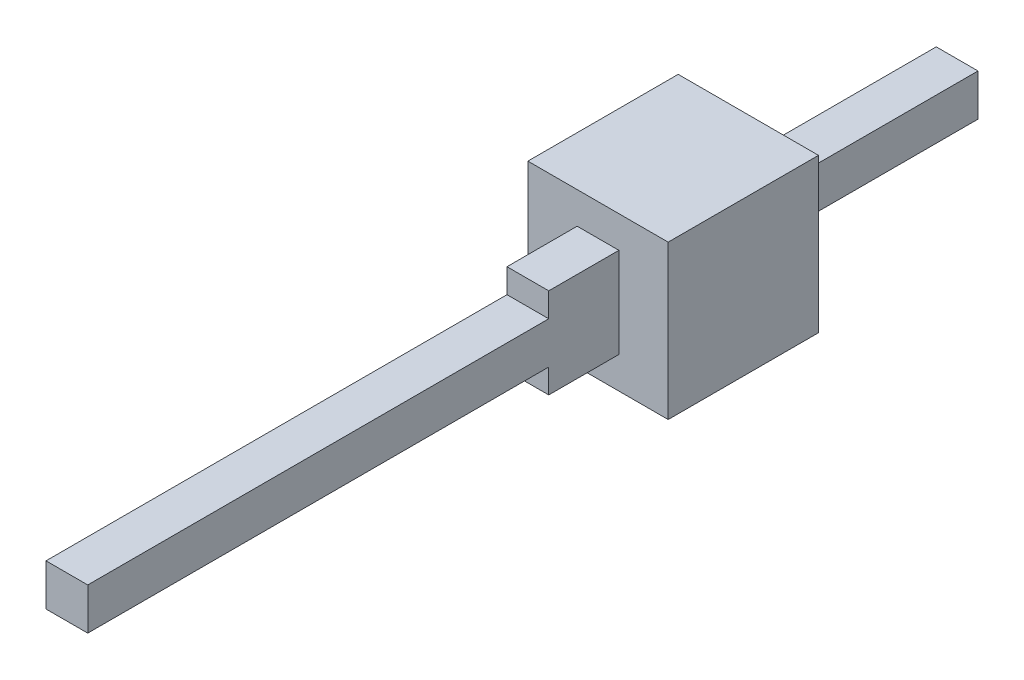
ISO-10303-21;
HEADER;
FILE_DESCRIPTION(('STEP AP214'),'2;1');
FILE_NAME('part.step','',(''),(''),'','','');
FILE_SCHEMA(('AUTOMOTIVE_DESIGN { 1 0 10303 214 1 1 1 1 }'));
ENDSEC;
DATA;
#1=APPLICATION_CONTEXT('core data for automotive mechanical design processes');
#2=APPLICATION_PROTOCOL_DEFINITION('international standard','automotive_design',2000,#1);
#3=PRODUCT_CONTEXT('',#1,'mechanical');
#4=PRODUCT('Part','Part','',(#3));
#5=PRODUCT_RELATED_PRODUCT_CATEGORY('part','',(#4));
#6=PRODUCT_DEFINITION_FORMATION('','',#4);
#7=PRODUCT_DEFINITION_CONTEXT('part definition',#1,'design');
#8=PRODUCT_DEFINITION('design','',#6,#7);
#9=PRODUCT_DEFINITION_SHAPE('','',#8);
#10=(LENGTH_UNIT() NAMED_UNIT(*) SI_UNIT(.MILLI.,.METRE.));
#11=(NAMED_UNIT(*) PLANE_ANGLE_UNIT() SI_UNIT($,.RADIAN.));
#12=(NAMED_UNIT(*) SI_UNIT($,.STERADIAN.) SOLID_ANGLE_UNIT());
#13=UNCERTAINTY_MEASURE_WITH_UNIT(LENGTH_MEASURE(1.E-05),#10,'distance_accuracy_value','');
#14=(GEOMETRIC_REPRESENTATION_CONTEXT(3) GLOBAL_UNCERTAINTY_ASSIGNED_CONTEXT((#13)) GLOBAL_UNIT_ASSIGNED_CONTEXT((#10,
#11,#12)) REPRESENTATION_CONTEXT('',''));
#15=CARTESIAN_POINT('',(0.,0.,0.));
#16=DIRECTION('',(0.,0.,1.));
#17=DIRECTION('',(1.,0.,0.));
#18=AXIS2_PLACEMENT_3D('',#15,#16,#17);
#19=CARTESIAN_POINT('',(0.3175,-0.3175,-5.461));
#20=DIRECTION('',(0.,-1.,0.));
#21=DIRECTION('',(0.,0.,-1.));
#22=AXIS2_PLACEMENT_3D('',#19,#20,#21);
#23=PLANE('',#22);
#24=DIRECTION('',(0.,0.,1.));
#25=VECTOR('',#24,1.);
#26=CARTESIAN_POINT('',(0.3175,-0.3175,0.));
#27=LINE('',#26,#25);
#28=CARTESIAN_POINT('',(0.3175,-0.3175,-5.461));
#29=VERTEX_POINT('',#28);
#30=CARTESIAN_POINT('',(0.3175,-0.3175,-2.286));
#31=VERTEX_POINT('',#30);
#32=EDGE_CURVE('E157',#29,#31,#27,.T.);
#33=ORIENTED_EDGE('',*,*,#32,.T.);
#34=DIRECTION('',(1.,0.,0.));
#35=VECTOR('',#34,1.);
#36=CARTESIAN_POINT('',(0.3175,-0.3175,-2.286));
#37=LINE('',#36,#35);
#38=CARTESIAN_POINT('',(-0.3175,-0.3175,-2.286));
#39=VERTEX_POINT('',#38);
#40=EDGE_CURVE('E20',#31,#39,#37,.F.);
#41=ORIENTED_EDGE('',*,*,#40,.T.);
#42=DIRECTION('',(0.,0.,1.));
#43=VECTOR('',#42,1.);
#44=CARTESIAN_POINT('',(-0.3175,-0.3175,0.));
#45=LINE('',#44,#43);
#46=CARTESIAN_POINT('',(-0.3175,-0.3175,-5.461));
#47=VERTEX_POINT('',#46);
#48=EDGE_CURVE('E193',#47,#39,#45,.T.);
#49=ORIENTED_EDGE('',*,*,#48,.F.);
#50=DIRECTION('',(-1.,0.,0.));
#51=VECTOR('',#50,1.);
#52=CARTESIAN_POINT('',(0.3175,-0.3175,-5.461));
#53=LINE('',#52,#51);
#54=EDGE_CURVE('E178',#29,#47,#53,.T.);
#55=ORIENTED_EDGE('',*,*,#54,.F.);
#56=EDGE_LOOP('',(#33,#41,#49,#55));
#57=FACE_BOUND('',#56,.T.);
#58=ADVANCED_FACE('F17',(#57),#23,.T.);
#59=CARTESIAN_POINT('',(0.3175,0.,0.));
#60=DIRECTION('',(-1.,0.,0.));
#61=DIRECTION('',(0.,0.,1.));
#62=AXIS2_PLACEMENT_3D('',#59,#60,#61);
#63=PLANE('',#62);
#64=DIRECTION('',(0.,1.,0.));
#65=VECTOR('',#64,1.);
#66=CARTESIAN_POINT('',(0.3175,0.3175,-5.461));
#67=LINE('',#66,#65);
#68=CARTESIAN_POINT('',(0.3175,0.3175,-5.461));
#69=VERTEX_POINT('',#68);
#70=EDGE_CURVE('E184',#69,#29,#67,.F.);
#71=ORIENTED_EDGE('',*,*,#70,.F.);
#72=DIRECTION('',(0.,0.,1.));
#73=VECTOR('',#72,1.);
#74=CARTESIAN_POINT('',(0.3175,0.3175,-2.286));
#75=LINE('',#74,#73);
#76=CARTESIAN_POINT('',(0.3175,0.3175,-2.286));
#77=VERTEX_POINT('',#76);
#78=EDGE_CURVE('E164',#77,#69,#75,.F.);
#79=ORIENTED_EDGE('',*,*,#78,.F.);
#80=DIRECTION('',(0.,1.,0.));
#81=VECTOR('',#80,1.);
#82=CARTESIAN_POINT('',(0.3175,0.,-2.286));
#83=LINE('',#82,#81);
#84=EDGE_CURVE('E161',#31,#77,#83,.T.);
#85=ORIENTED_EDGE('',*,*,#84,.F.);
#86=ORIENTED_EDGE('',*,*,#32,.F.);
#87=EDGE_LOOP('',(#71,#79,#85,#86));
#88=FACE_BOUND('',#87,.T.);
#89=ADVANCED_FACE('F163',(#88),#63,.F.);
#90=CARTESIAN_POINT('',(0.3175,0.3175,-5.461));
#91=DIRECTION('',(0.,0.,-1.));
#92=DIRECTION('',(-1.,0.,0.));
#93=AXIS2_PLACEMENT_3D('',#90,#91,#92);
#94=PLANE('',#93);
#95=DIRECTION('',(1.,0.,0.));
#96=VECTOR('',#95,1.);
#97=CARTESIAN_POINT('',(0.3175,0.3175,-5.461));
#98=LINE('',#97,#96);
#99=CARTESIAN_POINT('',(-0.3175,0.3175,-5.461));
#100=VERTEX_POINT('',#99);
#101=EDGE_CURVE('E200',#69,#100,#98,.F.);
#102=ORIENTED_EDGE('',*,*,#101,.F.);
#103=ORIENTED_EDGE('',*,*,#70,.T.);
#104=ORIENTED_EDGE('',*,*,#54,.T.);
#105=DIRECTION('',(0.,1.,0.));
#106=VECTOR('',#105,1.);
#107=CARTESIAN_POINT('',(-0.3175,0.,-5.461));
#108=LINE('',#107,#106);
#109=EDGE_CURVE('E189',#100,#47,#108,.F.);
#110=ORIENTED_EDGE('',*,*,#109,.F.);
#111=EDGE_LOOP('',(#102,#103,#104,#110));
#112=FACE_BOUND('',#111,.T.);
#113=ADVANCED_FACE('F408',(#112),#94,.T.);
#114=CARTESIAN_POINT('',(-0.3175,0.,0.));
#115=DIRECTION('',(-1.,0.,0.));
#116=DIRECTION('',(0.,0.,1.));
#117=AXIS2_PLACEMENT_3D('',#114,#115,#116);
#118=PLANE('',#117);
#119=ORIENTED_EDGE('',*,*,#48,.T.);
#120=DIRECTION('',(0.,1.,0.));
#121=VECTOR('',#120,1.);
#122=CARTESIAN_POINT('',(-0.3175,0.,-2.286));
#123=LINE('',#122,#121);
#124=CARTESIAN_POINT('',(-0.3175,0.3175,-2.286));
#125=VERTEX_POINT('',#124);
#126=EDGE_CURVE('E172',#39,#125,#123,.T.);
#127=ORIENTED_EDGE('',*,*,#126,.T.);
#128=DIRECTION('',(0.,0.,1.));
#129=VECTOR('',#128,1.);
#130=CARTESIAN_POINT('',(-0.3175,0.3175,-2.286));
#131=LINE('',#130,#129);
#132=EDGE_CURVE('E203',#100,#125,#131,.T.);
#133=ORIENTED_EDGE('',*,*,#132,.F.);
#134=ORIENTED_EDGE('',*,*,#109,.T.);
#135=EDGE_LOOP('',(#119,#127,#133,#134));
#136=FACE_BOUND('',#135,.T.);
#137=ADVANCED_FACE('F404',(#136),#118,.T.);
#138=CARTESIAN_POINT('',(0.3175,0.3175,-2.286));
#139=DIRECTION('',(0.,1.,0.));
#140=DIRECTION('',(0.,0.,1.));
#141=AXIS2_PLACEMENT_3D('',#138,#139,#140);
#142=PLANE('',#141);
#143=ORIENTED_EDGE('',*,*,#132,.T.);
#144=DIRECTION('',(1.,0.,0.));
#145=VECTOR('',#144,1.);
#146=CARTESIAN_POINT('',(0.,0.3175,-2.286));
#147=LINE('',#146,#145);
#148=EDGE_CURVE('E207',#125,#77,#147,.T.);
#149=ORIENTED_EDGE('',*,*,#148,.T.);
#150=ORIENTED_EDGE('',*,*,#78,.T.);
#151=ORIENTED_EDGE('',*,*,#101,.T.);
#152=EDGE_LOOP('',(#143,#149,#150,#151));
#153=FACE_BOUND('',#152,.T.);
#154=ADVANCED_FACE('F401',(#153),#142,.T.);
#155=CARTESIAN_POINT('',(0.,0.,-2.286));
#156=DIRECTION('',(0.,0.,1.));
#157=DIRECTION('',(1.,0.,0.));
#158=AXIS2_PLACEMENT_3D('',#155,#156,#157);
#159=PLANE('',#158);
#160=ORIENTED_EDGE('',*,*,#126,.F.);
#161=ORIENTED_EDGE('',*,*,#40,.F.);
#162=ORIENTED_EDGE('',*,*,#84,.T.);
#163=ORIENTED_EDGE('',*,*,#148,.F.);
#164=EDGE_LOOP('',(#160,#161,#162,#163));
#165=FACE_BOUND('',#164,.T.);
#166=DIRECTION('',(0.,1.,0.));
#167=VECTOR('',#166,1.);
#168=CARTESIAN_POINT('',(1.0668,-1.1684,-2.286));
#169=LINE('',#168,#167);
#170=CARTESIAN_POINT('',(1.0668,-1.1684,-2.286));
#171=VERTEX_POINT('',#170);
#172=CARTESIAN_POINT('',(1.0668,1.1684,-2.286));
#173=VERTEX_POINT('',#172);
#174=EDGE_CURVE('E216',#171,#173,#169,.T.);
#175=ORIENTED_EDGE('',*,*,#174,.F.);
#176=DIRECTION('',(1.,0.,0.));
#177=VECTOR('',#176,1.);
#178=CARTESIAN_POINT('',(-1.0668,-1.1684,-2.286));
#179=LINE('',#178,#177);
#180=CARTESIAN_POINT('',(-1.0668,-1.1684,-2.286));
#181=VERTEX_POINT('',#180);
#182=EDGE_CURVE('E209',#181,#171,#179,.T.);
#183=ORIENTED_EDGE('',*,*,#182,.F.);
#184=DIRECTION('',(0.,1.,0.));
#185=VECTOR('',#184,1.);
#186=CARTESIAN_POINT('',(-1.0668,1.1684,-2.286));
#187=LINE('',#186,#185);
#188=CARTESIAN_POINT('',(-1.0668,1.1684,-2.286));
#189=VERTEX_POINT('',#188);
#190=EDGE_CURVE('E230',#189,#181,#187,.F.);
#191=ORIENTED_EDGE('',*,*,#190,.F.);
#192=DIRECTION('',(1.,0.,0.));
#193=VECTOR('',#192,1.);
#194=CARTESIAN_POINT('',(1.0668,1.1684,-2.286));
#195=LINE('',#194,#193);
#196=EDGE_CURVE('E223',#173,#189,#195,.F.);
#197=ORIENTED_EDGE('',*,*,#196,.F.);
#198=EDGE_LOOP('',(#175,#183,#191,#197));
#199=FACE_BOUND('',#198,.T.);
#200=ADVANCED_FACE('F170',(#165,#199),#159,.F.);
#201=CARTESIAN_POINT('',(-1.0668,-1.1684,0.));
#202=DIRECTION('',(0.,-1.,0.));
#203=DIRECTION('',(0.,0.,-1.));
#204=AXIS2_PLACEMENT_3D('',#201,#202,#203);
#205=PLANE('',#204);
#206=DIRECTION('',(0.,0.,-1.));
#207=VECTOR('',#206,1.);
#208=CARTESIAN_POINT('',(1.0668,-1.1684,0.));
#209=LINE('',#208,#207);
#210=CARTESIAN_POINT('',(1.0668,-1.1684,0.));
#211=VERTEX_POINT('',#210);
#212=EDGE_CURVE('E212',#211,#171,#209,.T.);
#213=ORIENTED_EDGE('',*,*,#212,.F.);
#214=DIRECTION('',(1.,0.,0.));
#215=VECTOR('',#214,1.);
#216=CARTESIAN_POINT('',(0.,-1.1684,0.));
#217=LINE('',#216,#215);
#218=CARTESIAN_POINT('',(-1.0668,-1.1684,0.));
#219=VERTEX_POINT('',#218);
#220=EDGE_CURVE('E242',#219,#211,#217,.T.);
#221=ORIENTED_EDGE('',*,*,#220,.F.);
#222=DIRECTION('',(0.,0.,1.));
#223=VECTOR('',#222,1.);
#224=CARTESIAN_POINT('',(-1.0668,-1.1684,0.));
#225=LINE('',#224,#223);
#226=EDGE_CURVE('E233',#181,#219,#225,.T.);
#227=ORIENTED_EDGE('',*,*,#226,.F.);
#228=ORIENTED_EDGE('',*,*,#182,.T.);
#229=EDGE_LOOP('',(#213,#221,#227,#228));
#230=FACE_BOUND('',#229,.T.);
#231=ADVANCED_FACE('F394',(#230),#205,.T.);
#232=CARTESIAN_POINT('',(1.0668,-1.1684,0.));
#233=DIRECTION('',(1.,0.,0.));
#234=DIRECTION('',(0.,0.,-1.));
#235=AXIS2_PLACEMENT_3D('',#232,#233,#234);
#236=PLANE('',#235);
#237=DIRECTION('',(0.,0.,1.));
#238=VECTOR('',#237,1.);
#239=CARTESIAN_POINT('',(1.0668,1.1684,0.));
#240=LINE('',#239,#238);
#241=CARTESIAN_POINT('',(1.0668,1.1684,0.));
#242=VERTEX_POINT('',#241);
#243=EDGE_CURVE('E219',#242,#173,#240,.F.);
#244=ORIENTED_EDGE('',*,*,#243,.F.);
#245=DIRECTION('',(0.,1.,0.));
#246=VECTOR('',#245,1.);
#247=CARTESIAN_POINT('',(1.0668,0.,0.));
#248=LINE('',#247,#246);
#249=EDGE_CURVE('E245',#211,#242,#248,.T.);
#250=ORIENTED_EDGE('',*,*,#249,.F.);
#251=ORIENTED_EDGE('',*,*,#212,.T.);
#252=ORIENTED_EDGE('',*,*,#174,.T.);
#253=EDGE_LOOP('',(#244,#250,#251,#252));
#254=FACE_BOUND('',#253,.T.);
#255=ADVANCED_FACE('F390',(#254),#236,.T.);
#256=CARTESIAN_POINT('',(1.0668,1.1684,0.));
#257=DIRECTION('',(0.,1.,0.));
#258=DIRECTION('',(0.,0.,1.));
#259=AXIS2_PLACEMENT_3D('',#256,#257,#258);
#260=PLANE('',#259);
#261=DIRECTION('',(0.,0.,1.));
#262=VECTOR('',#261,1.);
#263=CARTESIAN_POINT('',(-1.0668,1.1684,0.));
#264=LINE('',#263,#262);
#265=CARTESIAN_POINT('',(-1.0668,1.1684,0.));
#266=VERTEX_POINT('',#265);
#267=EDGE_CURVE('E226',#266,#189,#264,.F.);
#268=ORIENTED_EDGE('',*,*,#267,.F.);
#269=DIRECTION('',(1.,0.,0.));
#270=VECTOR('',#269,1.);
#271=CARTESIAN_POINT('',(0.,1.1684,0.));
#272=LINE('',#271,#270);
#273=EDGE_CURVE('E248',#242,#266,#272,.F.);
#274=ORIENTED_EDGE('',*,*,#273,.F.);
#275=ORIENTED_EDGE('',*,*,#243,.T.);
#276=ORIENTED_EDGE('',*,*,#196,.T.);
#277=EDGE_LOOP('',(#268,#274,#275,#276));
#278=FACE_BOUND('',#277,.T.);
#279=ADVANCED_FACE('F386',(#278),#260,.T.);
#280=CARTESIAN_POINT('',(-1.0668,1.1684,0.));
#281=DIRECTION('',(-1.,0.,0.));
#282=DIRECTION('',(0.,0.,1.));
#283=AXIS2_PLACEMENT_3D('',#280,#281,#282);
#284=PLANE('',#283);
#285=ORIENTED_EDGE('',*,*,#226,.T.);
#286=DIRECTION('',(0.,1.,0.));
#287=VECTOR('',#286,1.);
#288=CARTESIAN_POINT('',(-1.0668,0.,0.));
#289=LINE('',#288,#287);
#290=EDGE_CURVE('E251',#266,#219,#289,.F.);
#291=ORIENTED_EDGE('',*,*,#290,.F.);
#292=ORIENTED_EDGE('',*,*,#267,.T.);
#293=ORIENTED_EDGE('',*,*,#190,.T.);
#294=EDGE_LOOP('',(#285,#291,#292,#293));
#295=FACE_BOUND('',#294,.T.);
#296=ADVANCED_FACE('F382',(#295),#284,.T.);
#297=CARTESIAN_POINT('',(-0.3175,0.,0.));
#298=DIRECTION('',(-1.,0.,0.));
#299=DIRECTION('',(0.,0.,1.));
#300=AXIS2_PLACEMENT_3D('',#297,#298,#299);
#301=PLANE('',#300);
#302=DIRECTION('',(0.,0.,1.));
#303=VECTOR('',#302,1.);
#304=CARTESIAN_POINT('',(-0.3175,0.6858,0.));
#305=LINE('',#304,#303);
#306=CARTESIAN_POINT('',(-0.3175,0.6858,1.0668));
#307=VERTEX_POINT('',#306);
#308=CARTESIAN_POINT('',(-0.3175,0.6858,0.));
#309=VERTEX_POINT('',#308);
#310=EDGE_CURVE('E239',#307,#309,#305,.F.);
#311=ORIENTED_EDGE('',*,*,#310,.T.);
#312=DIRECTION('',(0.,1.,0.));
#313=VECTOR('',#312,1.);
#314=CARTESIAN_POINT('',(-0.3175,0.,0.));
#315=LINE('',#314,#313);
#316=CARTESIAN_POINT('',(-0.3175,-0.6858,0.));
#317=VERTEX_POINT('',#316);
#318=EDGE_CURVE('E255',#317,#309,#315,.T.);
#319=ORIENTED_EDGE('',*,*,#318,.F.);
#320=DIRECTION('',(0.,0.,-1.));
#321=VECTOR('',#320,1.);
#322=CARTESIAN_POINT('',(-0.3175,-0.6858,0.));
#323=LINE('',#322,#321);
#324=CARTESIAN_POINT('',(-0.3175,-0.6858,1.0668));
#325=VERTEX_POINT('',#324);
#326=EDGE_CURVE('E259',#325,#317,#323,.T.);
#327=ORIENTED_EDGE('',*,*,#326,.F.);
#328=DIRECTION('',(0.,1.,0.));
#329=VECTOR('',#328,1.);
#330=CARTESIAN_POINT('',(-0.3175,-0.6858,1.0668));
#331=LINE('',#330,#329);
#332=CARTESIAN_POINT('',(-0.3175,-0.3175,1.0668));
#333=VERTEX_POINT('',#332);
#334=EDGE_CURVE('E265',#333,#325,#331,.F.);
#335=ORIENTED_EDGE('',*,*,#334,.F.);
#336=DIRECTION('',(0.,0.,-1.));
#337=VECTOR('',#336,1.);
#338=CARTESIAN_POINT('',(-0.3175,-0.3175,1.0668));
#339=LINE('',#338,#337);
#340=CARTESIAN_POINT('',(-0.3175,-0.3175,8.0772));
#341=VERTEX_POINT('',#340);
#342=EDGE_CURVE('E271',#341,#333,#339,.T.);
#343=ORIENTED_EDGE('',*,*,#342,.F.);
#344=DIRECTION('',(0.,1.,0.));
#345=VECTOR('',#344,1.);
#346=CARTESIAN_POINT('',(-0.3175,-0.3175,8.0772));
#347=LINE('',#346,#345);
#348=CARTESIAN_POINT('',(-0.3175,0.3175,8.0772));
#349=VERTEX_POINT('',#348);
#350=EDGE_CURVE('E277',#349,#341,#347,.F.);
#351=ORIENTED_EDGE('',*,*,#350,.F.);
#352=DIRECTION('',(0.,0.,1.));
#353=VECTOR('',#352,1.);
#354=CARTESIAN_POINT('',(-0.3175,0.3175,8.0772));
#355=LINE('',#354,#353);
#356=CARTESIAN_POINT('',(-0.3175,0.3175,1.0668));
#357=VERTEX_POINT('',#356);
#358=EDGE_CURVE('E281',#357,#349,#355,.T.);
#359=ORIENTED_EDGE('',*,*,#358,.F.);
#360=DIRECTION('',(0.,1.,0.));
#361=VECTOR('',#360,1.);
#362=CARTESIAN_POINT('',(-0.3175,0.,1.0668));
#363=LINE('',#362,#361);
#364=EDGE_CURVE('E236',#357,#307,#363,.T.);
#365=ORIENTED_EDGE('',*,*,#364,.T.);
#366=EDGE_LOOP('',(#311,#319,#327,#335,#343,#351,#359,#365));
#367=FACE_BOUND('',#366,.T.);
#368=ADVANCED_FACE('F379',(#367),#301,.T.);
#369=CARTESIAN_POINT('',(0.,0.,0.));
#370=DIRECTION('',(0.,0.,1.));
#371=DIRECTION('',(1.,0.,0.));
#372=AXIS2_PLACEMENT_3D('',#369,#370,#371);
#373=PLANE('',#372);
#374=DIRECTION('',(1.,0.,0.));
#375=VECTOR('',#374,1.);
#376=CARTESIAN_POINT('',(0.3175,0.6858,0.));
#377=LINE('',#376,#375);
#378=CARTESIAN_POINT('',(0.3175,0.6858,0.));
#379=VERTEX_POINT('',#378);
#380=EDGE_CURVE('E291',#379,#309,#377,.F.);
#381=ORIENTED_EDGE('',*,*,#380,.F.);
#382=DIRECTION('',(0.,1.,0.));
#383=VECTOR('',#382,1.);
#384=CARTESIAN_POINT('',(0.3175,0.,0.));
#385=LINE('',#384,#383);
#386=CARTESIAN_POINT('',(0.3175,-0.6858,0.));
#387=VERTEX_POINT('',#386);
#388=EDGE_CURVE('E295',#379,#387,#385,.F.);
#389=ORIENTED_EDGE('',*,*,#388,.T.);
#390=DIRECTION('',(1.,0.,0.));
#391=VECTOR('',#390,1.);
#392=CARTESIAN_POINT('',(0.3175,-0.6858,0.));
#393=LINE('',#392,#391);
#394=EDGE_CURVE('E262',#317,#387,#393,.T.);
#395=ORIENTED_EDGE('',*,*,#394,.F.);
#396=ORIENTED_EDGE('',*,*,#318,.T.);
#397=EDGE_LOOP('',(#381,#389,#395,#396));
#398=FACE_BOUND('',#397,.T.);
#399=ORIENTED_EDGE('',*,*,#273,.T.);
#400=ORIENTED_EDGE('',*,*,#290,.T.);
#401=ORIENTED_EDGE('',*,*,#220,.T.);
#402=ORIENTED_EDGE('',*,*,#249,.T.);
#403=EDGE_LOOP('',(#399,#400,#401,#402));
#404=FACE_BOUND('',#403,.T.);
#405=ADVANCED_FACE('F354',(#398,#404),#373,.T.);
#406=CARTESIAN_POINT('',(0.3175,-0.6858,0.));
#407=DIRECTION('',(0.,-1.,0.));
#408=DIRECTION('',(0.,0.,-1.));
#409=AXIS2_PLACEMENT_3D('',#406,#407,#408);
#410=PLANE('',#409);
#411=ORIENTED_EDGE('',*,*,#326,.T.);
#412=ORIENTED_EDGE('',*,*,#394,.T.);
#413=DIRECTION('',(0.,0.,1.));
#414=VECTOR('',#413,1.);
#415=CARTESIAN_POINT('',(0.3175,-0.6858,0.));
#416=LINE('',#415,#414);
#417=CARTESIAN_POINT('',(0.3175,-0.6858,1.0668));
#418=VERTEX_POINT('',#417);
#419=EDGE_CURVE('E299',#387,#418,#416,.T.);
#420=ORIENTED_EDGE('',*,*,#419,.T.);
#421=DIRECTION('',(1.,0.,0.));
#422=VECTOR('',#421,1.);
#423=CARTESIAN_POINT('',(0.3175,-0.6858,1.0668));
#424=LINE('',#423,#422);
#425=EDGE_CURVE('E268',#325,#418,#424,.T.);
#426=ORIENTED_EDGE('',*,*,#425,.F.);
#427=EDGE_LOOP('',(#411,#412,#420,#426));
#428=FACE_BOUND('',#427,.T.);
#429=ADVANCED_FACE('F349',(#428),#410,.T.);
#430=CARTESIAN_POINT('',(0.3175,-0.6858,1.0668));
#431=DIRECTION('',(0.,0.,1.));
#432=DIRECTION('',(1.,0.,0.));
#433=AXIS2_PLACEMENT_3D('',#430,#431,#432);
#434=PLANE('',#433);
#435=ORIENTED_EDGE('',*,*,#425,.T.);
#436=DIRECTION('',(0.,1.,0.));
#437=VECTOR('',#436,1.);
#438=CARTESIAN_POINT('',(0.3175,0.,1.0668));
#439=LINE('',#438,#437);
#440=CARTESIAN_POINT('',(0.3175,-0.3175,1.0668));
#441=VERTEX_POINT('',#440);
#442=EDGE_CURVE('E303',#418,#441,#439,.T.);
#443=ORIENTED_EDGE('',*,*,#442,.T.);
#444=DIRECTION('',(1.,0.,0.));
#445=VECTOR('',#444,1.);
#446=CARTESIAN_POINT('',(0.3175,-0.3175,1.0668));
#447=LINE('',#446,#445);
#448=EDGE_CURVE('E274',#333,#441,#447,.T.);
#449=ORIENTED_EDGE('',*,*,#448,.F.);
#450=ORIENTED_EDGE('',*,*,#334,.T.);
#451=EDGE_LOOP('',(#435,#443,#449,#450));
#452=FACE_BOUND('',#451,.T.);
#453=ADVANCED_FACE('F344',(#452),#434,.T.);
#454=CARTESIAN_POINT('',(0.3175,-0.3175,1.0668));
#455=DIRECTION('',(0.,-1.,0.));
#456=DIRECTION('',(0.,0.,-1.));
#457=AXIS2_PLACEMENT_3D('',#454,#455,#456);
#458=PLANE('',#457);
#459=ORIENTED_EDGE('',*,*,#448,.T.);
#460=DIRECTION('',(0.,0.,1.));
#461=VECTOR('',#460,1.);
#462=CARTESIAN_POINT('',(0.3175,-0.3175,0.));
#463=LINE('',#462,#461);
#464=CARTESIAN_POINT('',(0.3175,-0.3175,8.0772));
#465=VERTEX_POINT('',#464);
#466=EDGE_CURVE('E307',#441,#465,#463,.T.);
#467=ORIENTED_EDGE('',*,*,#466,.T.);
#468=DIRECTION('',(1.,0.,0.));
#469=VECTOR('',#468,1.);
#470=CARTESIAN_POINT('',(0.3175,-0.3175,8.0772));
#471=LINE('',#470,#469);
#472=EDGE_CURVE('E279',#341,#465,#471,.T.);
#473=ORIENTED_EDGE('',*,*,#472,.F.);
#474=ORIENTED_EDGE('',*,*,#342,.T.);
#475=EDGE_LOOP('',(#459,#467,#473,#474));
#476=FACE_BOUND('',#475,.T.);
#477=ADVANCED_FACE('F340',(#476),#458,.T.);
#478=CARTESIAN_POINT('',(0.3175,-0.3175,8.0772));
#479=DIRECTION('',(0.,0.,1.));
#480=DIRECTION('',(1.,0.,0.));
#481=AXIS2_PLACEMENT_3D('',#478,#479,#480);
#482=PLANE('',#481);
#483=ORIENTED_EDGE('',*,*,#472,.T.);
#484=DIRECTION('',(0.,1.,0.));
#485=VECTOR('',#484,1.);
#486=CARTESIAN_POINT('',(0.3175,0.,8.0772));
#487=LINE('',#486,#485);
#488=CARTESIAN_POINT('',(0.3175,0.3175,8.0772));
#489=VERTEX_POINT('',#488);
#490=EDGE_CURVE('E311',#465,#489,#487,.T.);
#491=ORIENTED_EDGE('',*,*,#490,.T.);
#492=DIRECTION('',(1.,0.,0.));
#493=VECTOR('',#492,1.);
#494=CARTESIAN_POINT('',(0.3175,0.3175,8.0772));
#495=LINE('',#494,#493);
#496=EDGE_CURVE('E284',#349,#489,#495,.T.);
#497=ORIENTED_EDGE('',*,*,#496,.F.);
#498=ORIENTED_EDGE('',*,*,#350,.T.);
#499=EDGE_LOOP('',(#483,#491,#497,#498));
#500=FACE_BOUND('',#499,.T.);
#501=ADVANCED_FACE('F334',(#500),#482,.T.);
#502=CARTESIAN_POINT('',(0.3175,0.3175,8.0772));
#503=DIRECTION('',(0.,1.,0.));
#504=DIRECTION('',(0.,0.,1.));
#505=AXIS2_PLACEMENT_3D('',#502,#503,#504);
#506=PLANE('',#505);
#507=ORIENTED_EDGE('',*,*,#496,.T.);
#508=DIRECTION('',(0.,0.,1.));
#509=VECTOR('',#508,1.);
#510=CARTESIAN_POINT('',(0.3175,0.3175,0.));
#511=LINE('',#510,#509);
#512=CARTESIAN_POINT('',(0.3175,0.3175,1.0668));
#513=VERTEX_POINT('',#512);
#514=EDGE_CURVE('E314',#489,#513,#511,.F.);
#515=ORIENTED_EDGE('',*,*,#514,.T.);
#516=DIRECTION('',(1.,0.,0.));
#517=VECTOR('',#516,1.);
#518=CARTESIAN_POINT('',(0.3175,0.3175,1.0668));
#519=LINE('',#518,#517);
#520=EDGE_CURVE('E286',#357,#513,#519,.T.);
#521=ORIENTED_EDGE('',*,*,#520,.F.);
#522=ORIENTED_EDGE('',*,*,#358,.T.);
#523=EDGE_LOOP('',(#507,#515,#521,#522));
#524=FACE_BOUND('',#523,.T.);
#525=ADVANCED_FACE('F329',(#524),#506,.T.);
#526=CARTESIAN_POINT('',(0.3175,0.3175,1.0668));
#527=DIRECTION('',(0.,0.,1.));
#528=DIRECTION('',(1.,0.,0.));
#529=AXIS2_PLACEMENT_3D('',#526,#527,#528);
#530=PLANE('',#529);
#531=ORIENTED_EDGE('',*,*,#520,.T.);
#532=DIRECTION('',(0.,1.,0.));
#533=VECTOR('',#532,1.);
#534=CARTESIAN_POINT('',(0.3175,0.,1.0668));
#535=LINE('',#534,#533);
#536=CARTESIAN_POINT('',(0.3175,0.6858,1.0668));
#537=VERTEX_POINT('',#536);
#538=EDGE_CURVE('E27',#513,#537,#535,.T.);
#539=ORIENTED_EDGE('',*,*,#538,.T.);
#540=DIRECTION('',(1.,0.,0.));
#541=VECTOR('',#540,1.);
#542=CARTESIAN_POINT('',(0.3175,0.6858,1.0668));
#543=LINE('',#542,#541);
#544=EDGE_CURVE('E38',#307,#537,#543,.T.);
#545=ORIENTED_EDGE('',*,*,#544,.F.);
#546=ORIENTED_EDGE('',*,*,#364,.F.);
#547=EDGE_LOOP('',(#531,#539,#545,#546));
#548=FACE_BOUND('',#547,.T.);
#549=ADVANCED_FACE('F322',(#548),#530,.T.);
#550=CARTESIAN_POINT('',(0.3175,0.6858,1.0668));
#551=DIRECTION('',(0.,1.,0.));
#552=DIRECTION('',(0.,0.,1.));
#553=AXIS2_PLACEMENT_3D('',#550,#551,#552);
#554=PLANE('',#553);
#555=DIRECTION('',(0.,0.,1.));
#556=VECTOR('',#555,1.);
#557=CARTESIAN_POINT('',(0.3175,0.6858,0.));
#558=LINE('',#557,#556);
#559=EDGE_CURVE('E11',#537,#379,#558,.F.);
#560=ORIENTED_EDGE('',*,*,#559,.T.);
#561=ORIENTED_EDGE('',*,*,#380,.T.);
#562=ORIENTED_EDGE('',*,*,#310,.F.);
#563=ORIENTED_EDGE('',*,*,#544,.T.);
#564=EDGE_LOOP('',(#560,#561,#562,#563));
#565=FACE_BOUND('',#564,.T.);
#566=ADVANCED_FACE('F356',(#565),#554,.T.);
#567=CARTESIAN_POINT('',(0.3175,0.,0.));
#568=DIRECTION('',(-1.,0.,0.));
#569=DIRECTION('',(0.,0.,1.));
#570=AXIS2_PLACEMENT_3D('',#567,#568,#569);
#571=PLANE('',#570);
#572=ORIENTED_EDGE('',*,*,#538,.F.);
#573=ORIENTED_EDGE('',*,*,#514,.F.);
#574=ORIENTED_EDGE('',*,*,#490,.F.);
#575=ORIENTED_EDGE('',*,*,#466,.F.);
#576=ORIENTED_EDGE('',*,*,#442,.F.);
#577=ORIENTED_EDGE('',*,*,#419,.F.);
#578=ORIENTED_EDGE('',*,*,#388,.F.);
#579=ORIENTED_EDGE('',*,*,#559,.F.);
#580=EDGE_LOOP('',(#572,#573,#574,#575,#576,#577,#578,#579));
#581=FACE_BOUND('',#580,.T.);
#582=ADVANCED_FACE('F326',(#581),#571,.F.);
#583=CLOSED_SHELL('',(#58,#89,#113,#137,#154,#200,#231,#255,#279,#296,#368,#405,#429,#453,#477,
#501,#525,#549,#566,#582));
#584=MANIFOLD_SOLID_BREP('B1',#583);
#585=ADVANCED_BREP_SHAPE_REPRESENTATION('',(#18,#584),#14);
#586=SHAPE_DEFINITION_REPRESENTATION(#9,#585);
ENDSEC;
END-ISO-10303-21;
